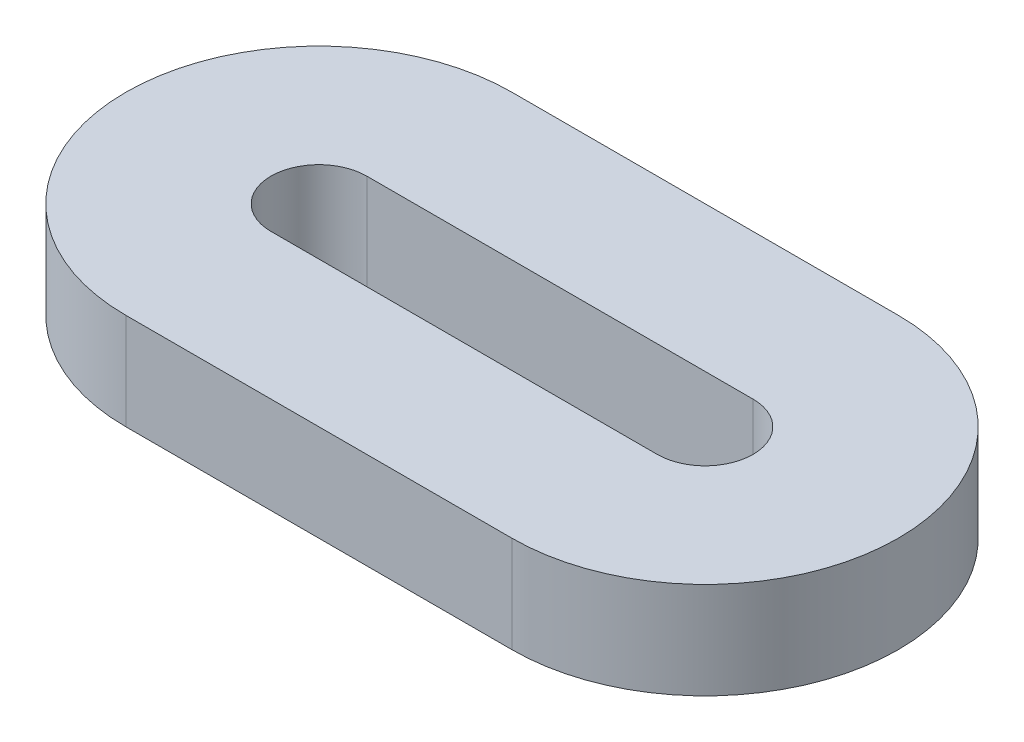
ISO-10303-21;
HEADER;
FILE_DESCRIPTION(('STEP AP214'),'2;1');
FILE_NAME('part.step','',(''),(''),'','','');
FILE_SCHEMA(('AUTOMOTIVE_DESIGN { 1 0 10303 214 1 1 1 1 }'));
ENDSEC;
DATA;
#1=APPLICATION_CONTEXT('core data for automotive mechanical design processes');
#2=APPLICATION_PROTOCOL_DEFINITION('international standard','automotive_design',2000,#1);
#3=PRODUCT_CONTEXT('',#1,'mechanical');
#4=PRODUCT('Part','Part','',(#3));
#5=PRODUCT_RELATED_PRODUCT_CATEGORY('part','',(#4));
#6=PRODUCT_DEFINITION_FORMATION('','',#4);
#7=PRODUCT_DEFINITION_CONTEXT('part definition',#1,'design');
#8=PRODUCT_DEFINITION('design','',#6,#7);
#9=PRODUCT_DEFINITION_SHAPE('','',#8);
#10=(LENGTH_UNIT() NAMED_UNIT(*) SI_UNIT(.MILLI.,.METRE.));
#11=(NAMED_UNIT(*) PLANE_ANGLE_UNIT() SI_UNIT($,.RADIAN.));
#12=(NAMED_UNIT(*) SI_UNIT($,.STERADIAN.) SOLID_ANGLE_UNIT());
#13=UNCERTAINTY_MEASURE_WITH_UNIT(LENGTH_MEASURE(1.E-05),#10,'distance_accuracy_value','');
#14=(GEOMETRIC_REPRESENTATION_CONTEXT(3) GLOBAL_UNCERTAINTY_ASSIGNED_CONTEXT((#13)) GLOBAL_UNIT_ASSIGNED_CONTEXT((#10,
#11,#12)) REPRESENTATION_CONTEXT('',''));
#15=CARTESIAN_POINT('',(0.,0.,0.));
#16=DIRECTION('',(0.,0.,1.));
#17=DIRECTION('',(1.,0.,0.));
#18=AXIS2_PLACEMENT_3D('',#15,#16,#17);
#19=CARTESIAN_POINT('',(-12.7,6.35,0.));
#20=DIRECTION('',(0.,1.,0.));
#21=DIRECTION('',(0.,0.,1.));
#22=AXIS2_PLACEMENT_3D('',#19,#20,#21);
#23=PLANE('',#22);
#24=CARTESIAN_POINT('',(-12.7,6.35,0.));
#25=DIRECTION('',(0.,1.,0.));
#26=DIRECTION('',(0.,0.,1.));
#27=AXIS2_PLACEMENT_3D('',#24,#25,#26);
#28=CIRCLE('',#27,12.7);
#29=CARTESIAN_POINT('',(-12.7,6.35,-12.7));
#30=VERTEX_POINT('',#29);
#31=CARTESIAN_POINT('',(-12.7,6.35,12.7));
#32=VERTEX_POINT('',#31);
#33=EDGE_CURVE('E140',#30,#32,#28,.T.);
#34=ORIENTED_EDGE('',*,*,#33,.T.);
#35=DIRECTION('',(1.,0.,0.));
#36=VECTOR('',#35,1.);
#37=CARTESIAN_POINT('',(-12.7,6.35,12.7));
#38=LINE('',#37,#36);
#39=CARTESIAN_POINT('',(12.7,6.35,12.7));
#40=VERTEX_POINT('',#39);
#41=EDGE_CURVE('E143',#32,#40,#38,.T.);
#42=ORIENTED_EDGE('',*,*,#41,.T.);
#43=CARTESIAN_POINT('',(12.7,6.35,0.));
#44=DIRECTION('',(0.,1.,0.));
#45=DIRECTION('',(0.,0.,1.));
#46=AXIS2_PLACEMENT_3D('',#43,#44,#45);
#47=CIRCLE('',#46,12.7);
#48=CARTESIAN_POINT('',(12.7,6.35,-12.7));
#49=VERTEX_POINT('',#48);
#50=EDGE_CURVE('E146',#40,#49,#47,.T.);
#51=ORIENTED_EDGE('',*,*,#50,.T.);
#52=DIRECTION('',(-1.,0.,0.));
#53=VECTOR('',#52,1.);
#54=CARTESIAN_POINT('',(-12.7,6.35,-12.7));
#55=LINE('',#54,#53);
#56=EDGE_CURVE('E148',#49,#30,#55,.T.);
#57=ORIENTED_EDGE('',*,*,#56,.T.);
#58=EDGE_LOOP('',(#34,#42,#51,#57));
#59=FACE_BOUND('',#58,.T.);
#60=DIRECTION('',(1.,0.,0.));
#61=VECTOR('',#60,1.);
#62=CARTESIAN_POINT('',(-12.7,6.35,3.15));
#63=LINE('',#62,#61);
#64=CARTESIAN_POINT('',(-12.7,6.35,3.15));
#65=VERTEX_POINT('',#64);
#66=CARTESIAN_POINT('',(12.7,6.35,3.15));
#67=VERTEX_POINT('',#66);
#68=EDGE_CURVE('E112',#65,#67,#63,.T.);
#69=ORIENTED_EDGE('',*,*,#68,.F.);
#70=CARTESIAN_POINT('',(-12.7,6.35,0.));
#71=DIRECTION('',(0.,1.,0.));
#72=DIRECTION('',(0.,0.,1.));
#73=AXIS2_PLACEMENT_3D('',#70,#71,#72);
#74=CIRCLE('',#73,3.15);
#75=CARTESIAN_POINT('',(-12.7,6.35,-3.15));
#76=VERTEX_POINT('',#75);
#77=EDGE_CURVE('E104',#76,#65,#74,.T.);
#78=ORIENTED_EDGE('',*,*,#77,.F.);
#79=DIRECTION('',(-1.,0.,0.));
#80=VECTOR('',#79,1.);
#81=CARTESIAN_POINT('',(-12.7,6.35,-3.15));
#82=LINE('',#81,#80);
#83=CARTESIAN_POINT('',(12.7,6.35,-3.15));
#84=VERTEX_POINT('',#83);
#85=EDGE_CURVE('E126',#84,#76,#82,.T.);
#86=ORIENTED_EDGE('',*,*,#85,.F.);
#87=CARTESIAN_POINT('',(12.7,6.35,0.));
#88=DIRECTION('',(0.,1.,0.));
#89=DIRECTION('',(0.,0.,1.));
#90=AXIS2_PLACEMENT_3D('',#87,#88,#89);
#91=CIRCLE('',#90,3.15);
#92=EDGE_CURVE('E124',#67,#84,#91,.T.);
#93=ORIENTED_EDGE('',*,*,#92,.F.);
#94=EDGE_LOOP('',(#69,#78,#86,#93));
#95=FACE_BOUND('',#94,.T.);
#96=ADVANCED_FACE('F39',(#59,#95),#23,.T.);
#97=CARTESIAN_POINT('',(-12.7,0.,0.));
#98=DIRECTION('',(0.,1.,0.));
#99=DIRECTION('',(0.,0.,1.));
#100=AXIS2_PLACEMENT_3D('',#97,#98,#99);
#101=PLANE('',#100);
#102=CARTESIAN_POINT('',(-12.7,0.,0.));
#103=DIRECTION('',(0.,1.,0.));
#104=DIRECTION('',(0.,0.,1.));
#105=AXIS2_PLACEMENT_3D('',#102,#103,#104);
#106=CIRCLE('',#105,12.7);
#107=CARTESIAN_POINT('',(-12.7,0.,-12.7));
#108=VERTEX_POINT('',#107);
#109=CARTESIAN_POINT('',(-12.7,0.,12.7));
#110=VERTEX_POINT('',#109);
#111=EDGE_CURVE('E120',#108,#110,#106,.T.);
#112=ORIENTED_EDGE('',*,*,#111,.F.);
#113=DIRECTION('',(-1.,0.,0.));
#114=VECTOR('',#113,1.);
#115=CARTESIAN_POINT('',(-12.7,0.,-12.7));
#116=LINE('',#115,#114);
#117=CARTESIAN_POINT('',(12.7,0.,-12.7));
#118=VERTEX_POINT('',#117);
#119=EDGE_CURVE('E144',#118,#108,#116,.T.);
#120=ORIENTED_EDGE('',*,*,#119,.F.);
#121=CARTESIAN_POINT('',(12.7,0.,0.));
#122=DIRECTION('',(0.,1.,0.));
#123=DIRECTION('',(0.,0.,1.));
#124=AXIS2_PLACEMENT_3D('',#121,#122,#123);
#125=CIRCLE('',#124,12.7);
#126=CARTESIAN_POINT('',(12.7,0.,12.7));
#127=VERTEX_POINT('',#126);
#128=EDGE_CURVE('E155',#127,#118,#125,.T.);
#129=ORIENTED_EDGE('',*,*,#128,.F.);
#130=DIRECTION('',(1.,0.,0.));
#131=VECTOR('',#130,1.);
#132=CARTESIAN_POINT('',(-12.7,0.,12.7));
#133=LINE('',#132,#131);
#134=EDGE_CURVE('E153',#110,#127,#133,.T.);
#135=ORIENTED_EDGE('',*,*,#134,.F.);
#136=EDGE_LOOP('',(#112,#120,#129,#135));
#137=FACE_BOUND('',#136,.T.);
#138=CARTESIAN_POINT('',(-12.7,0.,0.));
#139=DIRECTION('',(0.,1.,0.));
#140=DIRECTION('',(0.,0.,1.));
#141=AXIS2_PLACEMENT_3D('',#138,#139,#140);
#142=CIRCLE('',#141,3.15);
#143=CARTESIAN_POINT('',(-12.7,0.,-3.15));
#144=VERTEX_POINT('',#143);
#145=CARTESIAN_POINT('',(-12.7,0.,3.15));
#146=VERTEX_POINT('',#145);
#147=EDGE_CURVE('E62',#144,#146,#142,.T.);
#148=ORIENTED_EDGE('',*,*,#147,.T.);
#149=DIRECTION('',(1.,0.,0.));
#150=VECTOR('',#149,1.);
#151=CARTESIAN_POINT('',(-12.7,0.,3.15));
#152=LINE('',#151,#150);
#153=CARTESIAN_POINT('',(12.7,0.,3.15));
#154=VERTEX_POINT('',#153);
#155=EDGE_CURVE('E119',#146,#154,#152,.T.);
#156=ORIENTED_EDGE('',*,*,#155,.T.);
#157=CARTESIAN_POINT('',(12.7,0.,0.));
#158=DIRECTION('',(0.,1.,0.));
#159=DIRECTION('',(0.,0.,1.));
#160=AXIS2_PLACEMENT_3D('',#157,#158,#159);
#161=CIRCLE('',#160,3.15);
#162=CARTESIAN_POINT('',(12.7,0.,-3.15));
#163=VERTEX_POINT('',#162);
#164=EDGE_CURVE('E132',#154,#163,#161,.T.);
#165=ORIENTED_EDGE('',*,*,#164,.T.);
#166=DIRECTION('',(-1.,0.,0.));
#167=VECTOR('',#166,1.);
#168=CARTESIAN_POINT('',(-12.7,0.,-3.15));
#169=LINE('',#168,#167);
#170=EDGE_CURVE('E113',#163,#144,#169,.T.);
#171=ORIENTED_EDGE('',*,*,#170,.T.);
#172=EDGE_LOOP('',(#148,#156,#165,#171));
#173=FACE_BOUND('',#172,.T.);
#174=ADVANCED_FACE('F173',(#137,#173),#101,.F.);
#175=CARTESIAN_POINT('',(-12.7,6.35,0.));
#176=DIRECTION('',(0.,-1.,0.));
#177=DIRECTION('',(0.,0.,-1.));
#178=AXIS2_PLACEMENT_3D('',#175,#176,#177);
#179=CYLINDRICAL_SURFACE('',#178,12.7);
#180=ORIENTED_EDGE('',*,*,#111,.T.);
#181=DIRECTION('',(0.,-1.,0.));
#182=VECTOR('',#181,1.);
#183=CARTESIAN_POINT('',(-12.7,6.35,12.7));
#184=LINE('',#183,#182);
#185=EDGE_CURVE('E11',#32,#110,#184,.T.);
#186=ORIENTED_EDGE('',*,*,#185,.F.);
#187=ORIENTED_EDGE('',*,*,#33,.F.);
#188=DIRECTION('',(0.,-1.,0.));
#189=VECTOR('',#188,1.);
#190=CARTESIAN_POINT('',(-12.7,6.35,-12.7));
#191=LINE('',#190,#189);
#192=EDGE_CURVE('E150',#30,#108,#191,.T.);
#193=ORIENTED_EDGE('',*,*,#192,.T.);
#194=EDGE_LOOP('',(#180,#186,#187,#193));
#195=FACE_BOUND('',#194,.T.);
#196=ADVANCED_FACE('F41',(#195),#179,.T.);
#197=CARTESIAN_POINT('',(-12.7,6.35,12.7));
#198=DIRECTION('',(0.,0.,-1.));
#199=DIRECTION('',(-1.,0.,0.));
#200=AXIS2_PLACEMENT_3D('',#197,#198,#199);
#201=PLANE('',#200);
#202=ORIENTED_EDGE('',*,*,#134,.T.);
#203=DIRECTION('',(0.,-1.,0.));
#204=VECTOR('',#203,1.);
#205=CARTESIAN_POINT('',(12.7,6.35,12.7));
#206=LINE('',#205,#204);
#207=EDGE_CURVE('E47',#40,#127,#206,.T.);
#208=ORIENTED_EDGE('',*,*,#207,.F.);
#209=ORIENTED_EDGE('',*,*,#41,.F.);
#210=ORIENTED_EDGE('',*,*,#185,.T.);
#211=EDGE_LOOP('',(#202,#208,#209,#210));
#212=FACE_BOUND('',#211,.T.);
#213=ADVANCED_FACE('F183',(#212),#201,.F.);
#214=CARTESIAN_POINT('',(12.7,6.35,0.));
#215=DIRECTION('',(0.,-1.,0.));
#216=DIRECTION('',(0.,0.,-1.));
#217=AXIS2_PLACEMENT_3D('',#214,#215,#216);
#218=CYLINDRICAL_SURFACE('',#217,12.7);
#219=ORIENTED_EDGE('',*,*,#128,.T.);
#220=DIRECTION('',(0.,-1.,0.));
#221=VECTOR('',#220,1.);
#222=CARTESIAN_POINT('',(12.7,6.35,-12.7));
#223=LINE('',#222,#221);
#224=EDGE_CURVE('E160',#49,#118,#223,.T.);
#225=ORIENTED_EDGE('',*,*,#224,.F.);
#226=ORIENTED_EDGE('',*,*,#50,.F.);
#227=ORIENTED_EDGE('',*,*,#207,.T.);
#228=EDGE_LOOP('',(#219,#225,#226,#227));
#229=FACE_BOUND('',#228,.T.);
#230=ADVANCED_FACE('F167',(#229),#218,.T.);
#231=CARTESIAN_POINT('',(-12.7,6.35,-12.7));
#232=DIRECTION('',(0.,0.,1.));
#233=DIRECTION('',(1.,0.,0.));
#234=AXIS2_PLACEMENT_3D('',#231,#232,#233);
#235=PLANE('',#234);
#236=ORIENTED_EDGE('',*,*,#119,.T.);
#237=ORIENTED_EDGE('',*,*,#192,.F.);
#238=ORIENTED_EDGE('',*,*,#56,.F.);
#239=ORIENTED_EDGE('',*,*,#224,.T.);
#240=EDGE_LOOP('',(#236,#237,#238,#239));
#241=FACE_BOUND('',#240,.T.);
#242=ADVANCED_FACE('F177',(#241),#235,.F.);
#243=CARTESIAN_POINT('',(-12.7,6.35,0.));
#244=DIRECTION('',(0.,-1.,0.));
#245=DIRECTION('',(0.,0.,-1.));
#246=AXIS2_PLACEMENT_3D('',#243,#244,#245);
#247=CYLINDRICAL_SURFACE('',#246,3.15);
#248=ORIENTED_EDGE('',*,*,#147,.F.);
#249=DIRECTION('',(0.,-1.,0.));
#250=VECTOR('',#249,1.);
#251=CARTESIAN_POINT('',(-12.7,6.35,-3.15));
#252=LINE('',#251,#250);
#253=EDGE_CURVE('E108',#76,#144,#252,.T.);
#254=ORIENTED_EDGE('',*,*,#253,.F.);
#255=ORIENTED_EDGE('',*,*,#77,.T.);
#256=DIRECTION('',(0.,-1.,0.));
#257=VECTOR('',#256,1.);
#258=CARTESIAN_POINT('',(-12.7,6.35,3.15));
#259=LINE('',#258,#257);
#260=EDGE_CURVE('E107',#65,#146,#259,.T.);
#261=ORIENTED_EDGE('',*,*,#260,.T.);
#262=EDGE_LOOP('',(#248,#254,#255,#261));
#263=FACE_BOUND('',#262,.T.);
#264=ADVANCED_FACE('F106',(#263),#247,.F.);
#265=CARTESIAN_POINT('',(-12.7,6.35,3.15));
#266=DIRECTION('',(0.,0.,-1.));
#267=DIRECTION('',(-1.,0.,0.));
#268=AXIS2_PLACEMENT_3D('',#265,#266,#267);
#269=PLANE('',#268);
#270=ORIENTED_EDGE('',*,*,#155,.F.);
#271=ORIENTED_EDGE('',*,*,#260,.F.);
#272=ORIENTED_EDGE('',*,*,#68,.T.);
#273=DIRECTION('',(0.,-1.,0.));
#274=VECTOR('',#273,1.);
#275=CARTESIAN_POINT('',(12.7,6.35,3.15));
#276=LINE('',#275,#274);
#277=EDGE_CURVE('E121',#67,#154,#276,.T.);
#278=ORIENTED_EDGE('',*,*,#277,.T.);
#279=EDGE_LOOP('',(#270,#271,#272,#278));
#280=FACE_BOUND('',#279,.T.);
#281=ADVANCED_FACE('F116',(#280),#269,.T.);
#282=CARTESIAN_POINT('',(12.7,6.35,0.));
#283=DIRECTION('',(0.,-1.,0.));
#284=DIRECTION('',(0.,0.,-1.));
#285=AXIS2_PLACEMENT_3D('',#282,#283,#284);
#286=CYLINDRICAL_SURFACE('',#285,3.15);
#287=ORIENTED_EDGE('',*,*,#164,.F.);
#288=ORIENTED_EDGE('',*,*,#277,.F.);
#289=ORIENTED_EDGE('',*,*,#92,.T.);
#290=DIRECTION('',(0.,-1.,0.));
#291=VECTOR('',#290,1.);
#292=CARTESIAN_POINT('',(12.7,6.35,-3.15));
#293=LINE('',#292,#291);
#294=EDGE_CURVE('E54',#84,#163,#293,.T.);
#295=ORIENTED_EDGE('',*,*,#294,.T.);
#296=EDGE_LOOP('',(#287,#288,#289,#295));
#297=FACE_BOUND('',#296,.T.);
#298=ADVANCED_FACE('F206',(#297),#286,.F.);
#299=CARTESIAN_POINT('',(-12.7,6.35,-3.15));
#300=DIRECTION('',(0.,0.,1.));
#301=DIRECTION('',(1.,0.,0.));
#302=AXIS2_PLACEMENT_3D('',#299,#300,#301);
#303=PLANE('',#302);
#304=ORIENTED_EDGE('',*,*,#170,.F.);
#305=ORIENTED_EDGE('',*,*,#294,.F.);
#306=ORIENTED_EDGE('',*,*,#85,.T.);
#307=ORIENTED_EDGE('',*,*,#253,.T.);
#308=EDGE_LOOP('',(#304,#305,#306,#307));
#309=FACE_BOUND('',#308,.T.);
#310=ADVANCED_FACE('F210',(#309),#303,.T.);
#311=CLOSED_SHELL('',(#96,#174,#196,#213,#230,#242,#264,#281,#298,#310));
#312=MANIFOLD_SOLID_BREP('B2',#311);
#313=ADVANCED_BREP_SHAPE_REPRESENTATION('',(#18,#312),#14);
#314=SHAPE_DEFINITION_REPRESENTATION(#9,#313);
ENDSEC;
END-ISO-10303-21;
